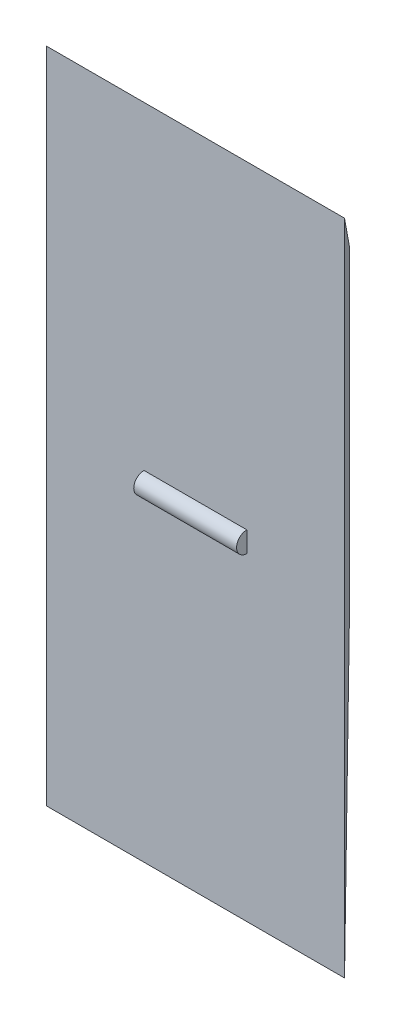
ISO-10303-21;
HEADER;
FILE_DESCRIPTION(('STEP AP214'),'2;1');
FILE_NAME('part.step','',(''),(''),'','','');
FILE_SCHEMA(('AUTOMOTIVE_DESIGN { 1 0 10303 214 1 1 1 1 }'));
ENDSEC;
DATA;
#1=APPLICATION_CONTEXT('core data for automotive mechanical design processes');
#2=APPLICATION_PROTOCOL_DEFINITION('international standard','automotive_design',2000,#1);
#3=PRODUCT_CONTEXT('',#1,'mechanical');
#4=PRODUCT('Part','Part','',(#3));
#5=PRODUCT_RELATED_PRODUCT_CATEGORY('part','',(#4));
#6=PRODUCT_DEFINITION_FORMATION('','',#4);
#7=PRODUCT_DEFINITION_CONTEXT('part definition',#1,'design');
#8=PRODUCT_DEFINITION('design','',#6,#7);
#9=PRODUCT_DEFINITION_SHAPE('','',#8);
#10=(LENGTH_UNIT() NAMED_UNIT(*) SI_UNIT(.MILLI.,.METRE.));
#11=(NAMED_UNIT(*) PLANE_ANGLE_UNIT() SI_UNIT($,.RADIAN.));
#12=(NAMED_UNIT(*) SI_UNIT($,.STERADIAN.) SOLID_ANGLE_UNIT());
#13=UNCERTAINTY_MEASURE_WITH_UNIT(LENGTH_MEASURE(1.E-05),#10,'distance_accuracy_value','');
#14=(GEOMETRIC_REPRESENTATION_CONTEXT(3) GLOBAL_UNCERTAINTY_ASSIGNED_CONTEXT((#13)) GLOBAL_UNIT_ASSIGNED_CONTEXT((#10,
#11,#12)) REPRESENTATION_CONTEXT('',''));
#15=CARTESIAN_POINT('',(0.,0.,0.));
#16=DIRECTION('',(0.,0.,1.));
#17=DIRECTION('',(1.,0.,0.));
#18=AXIS2_PLACEMENT_3D('',#15,#16,#17);
#19=CARTESIAN_POINT('',(0.,0.,30.));
#20=DIRECTION('',(0.,0.,1.));
#21=DIRECTION('',(1.,0.,0.));
#22=AXIS2_PLACEMENT_3D('',#19,#20,#21);
#23=PLANE('',#22);
#24=DIRECTION('',(1.,0.,0.));
#25=VECTOR('',#24,1.);
#26=CARTESIAN_POINT('',(-14.5,-64.,30.));
#27=LINE('',#26,#25);
#28=CARTESIAN_POINT('',(-14.5,-64.,30.));
#29=VERTEX_POINT('',#28);
#30=CARTESIAN_POINT('',(43.5,-64.,30.));
#31=VERTEX_POINT('',#30);
#32=EDGE_CURVE('E106',#29,#31,#27,.T.);
#33=ORIENTED_EDGE('',*,*,#32,.T.);
#34=DIRECTION('',(0.,1.,0.));
#35=VECTOR('',#34,1.);
#36=CARTESIAN_POINT('',(43.5,-64.,30.));
#37=LINE('',#36,#35);
#38=CARTESIAN_POINT('',(43.5,64.,30.));
#39=VERTEX_POINT('',#38);
#40=EDGE_CURVE('E187',#31,#39,#37,.T.);
#41=ORIENTED_EDGE('',*,*,#40,.T.);
#42=DIRECTION('',(-1.,0.,0.));
#43=VECTOR('',#42,1.);
#44=CARTESIAN_POINT('',(-14.5,64.,30.));
#45=LINE('',#44,#43);
#46=CARTESIAN_POINT('',(-14.5,64.,30.));
#47=VERTEX_POINT('',#46);
#48=EDGE_CURVE('E156',#39,#47,#45,.T.);
#49=ORIENTED_EDGE('',*,*,#48,.T.);
#50=DIRECTION('',(0.,-1.,0.));
#51=VECTOR('',#50,1.);
#52=CARTESIAN_POINT('',(-14.5,-64.,30.));
#53=LINE('',#52,#51);
#54=EDGE_CURVE('E113',#47,#29,#53,.T.);
#55=ORIENTED_EDGE('',*,*,#54,.T.);
#56=EDGE_LOOP('',(#33,#41,#49,#55));
#57=FACE_BOUND('',#56,.T.);
#58=DIRECTION('',(1.,0.,0.));
#59=VECTOR('',#58,1.);
#60=CARTESIAN_POINT('',(4.50000000000002,-2.,30.));
#61=LINE('',#60,#59);
#62=CARTESIAN_POINT('',(4.50000000000002,-2.,30.));
#63=VERTEX_POINT('',#62);
#64=CARTESIAN_POINT('',(24.5,-2.,30.));
#65=VERTEX_POINT('',#64);
#66=EDGE_CURVE('E52',#63,#65,#61,.T.);
#67=ORIENTED_EDGE('',*,*,#66,.F.);
#68=DIRECTION('',(0.,1.,0.));
#69=VECTOR('',#68,1.);
#70=CARTESIAN_POINT('',(4.50000000000002,0.,30.));
#71=LINE('',#70,#69);
#72=CARTESIAN_POINT('',(4.50000000000002,2.,30.));
#73=VERTEX_POINT('',#72);
#74=EDGE_CURVE('E12',#63,#73,#71,.T.);
#75=ORIENTED_EDGE('',*,*,#74,.T.);
#76=DIRECTION('',(1.,0.,0.));
#77=VECTOR('',#76,1.);
#78=CARTESIAN_POINT('',(4.50000000000002,2.,30.));
#79=LINE('',#78,#77);
#80=CARTESIAN_POINT('',(24.5,2.,30.));
#81=VERTEX_POINT('',#80);
#82=EDGE_CURVE('E89',#81,#73,#79,.F.);
#83=ORIENTED_EDGE('',*,*,#82,.F.);
#84=DIRECTION('',(0.,1.,0.));
#85=VECTOR('',#84,1.);
#86=CARTESIAN_POINT('',(24.5,0.,30.));
#87=LINE('',#86,#85);
#88=EDGE_CURVE('E91',#65,#81,#87,.T.);
#89=ORIENTED_EDGE('',*,*,#88,.F.);
#90=EDGE_LOOP('',(#67,#75,#83,#89));
#91=FACE_BOUND('',#90,.T.);
#92=ADVANCED_FACE('F43',(#57,#91),#23,.T.);
#93=CARTESIAN_POINT('',(0.,0.,0.));
#94=DIRECTION('',(0.,0.,1.));
#95=DIRECTION('',(1.,0.,0.));
#96=AXIS2_PLACEMENT_3D('',#93,#94,#95);
#97=PLANE('',#96);
#98=DIRECTION('',(0.,1.,0.));
#99=VECTOR('',#98,1.);
#100=CARTESIAN_POINT('',(14.5,29.5,0.));
#101=LINE('',#100,#99);
#102=CARTESIAN_POINT('',(14.5,-29.5,0.));
#103=VERTEX_POINT('',#102);
#104=CARTESIAN_POINT('',(14.5,29.5,0.));
#105=VERTEX_POINT('',#104);
#106=EDGE_CURVE('E235',#103,#105,#101,.T.);
#107=ORIENTED_EDGE('',*,*,#106,.F.);
#108=DIRECTION('',(1.,0.,0.));
#109=VECTOR('',#108,1.);
#110=CARTESIAN_POINT('',(-14.5,-29.5,0.));
#111=LINE('',#110,#109);
#112=CARTESIAN_POINT('',(-14.5,-29.5,0.));
#113=VERTEX_POINT('',#112);
#114=EDGE_CURVE('E229',#113,#103,#111,.T.);
#115=ORIENTED_EDGE('',*,*,#114,.F.);
#116=DIRECTION('',(0.,-1.,0.));
#117=VECTOR('',#116,1.);
#118=CARTESIAN_POINT('',(-14.5,29.5,0.));
#119=LINE('',#118,#117);
#120=CARTESIAN_POINT('',(-14.5,29.5,0.));
#121=VERTEX_POINT('',#120);
#122=EDGE_CURVE('E213',#121,#113,#119,.T.);
#123=ORIENTED_EDGE('',*,*,#122,.F.);
#124=DIRECTION('',(-1.,0.,0.));
#125=VECTOR('',#124,1.);
#126=CARTESIAN_POINT('',(-14.5,29.5,0.));
#127=LINE('',#126,#125);
#128=EDGE_CURVE('E101',#105,#121,#127,.T.);
#129=ORIENTED_EDGE('',*,*,#128,.F.);
#130=EDGE_LOOP('',(#107,#115,#123,#129));
#131=FACE_BOUND('',#130,.T.);
#132=ADVANCED_FACE('F45',(#131),#97,.F.);
#133=CARTESIAN_POINT('',(0.,12.7018299246502,-14.6071044133477));
#134=DIRECTION('',(0.,0.656178714924786,-0.754605522163505));
#135=DIRECTION('',(0.,0.754605522163505,0.656178714924787));
#136=AXIS2_PLACEMENT_3D('',#133,#134,#135);
#137=PLANE('',#136);
#138=DIRECTION('',(-0.535638231985947,-0.637224793224662,-0.554108515847532));
#139=VECTOR('',#138,1.);
#140=CARTESIAN_POINT('',(43.5,64.,30.));
#141=LINE('',#140,#139);
#142=EDGE_CURVE('E155',#39,#105,#141,.T.);
#143=ORIENTED_EDGE('',*,*,#142,.T.);
#144=ORIENTED_EDGE('',*,*,#128,.T.);
#145=DIRECTION('',(0.,-0.754605522163505,-0.656178714924787));
#146=VECTOR('',#145,1.);
#147=CARTESIAN_POINT('',(-14.5,64.,30.));
#148=LINE('',#147,#146);
#149=EDGE_CURVE('E119',#47,#121,#148,.T.);
#150=ORIENTED_EDGE('',*,*,#149,.F.);
#151=ORIENTED_EDGE('',*,*,#48,.F.);
#152=EDGE_LOOP('',(#143,#144,#150,#151));
#153=FACE_BOUND('',#152,.T.);
#154=ADVANCED_FACE('F132',(#153),#137,.T.);
#155=CARTESIAN_POINT('',(-14.5,0.,0.));
#156=DIRECTION('',(1.,0.,0.));
#157=DIRECTION('',(0.,0.,-1.));
#158=AXIS2_PLACEMENT_3D('',#155,#156,#157);
#159=PLANE('',#158);
#160=ORIENTED_EDGE('',*,*,#149,.T.);
#161=ORIENTED_EDGE('',*,*,#122,.T.);
#162=DIRECTION('',(0.,0.754605522163505,-0.656178714924787));
#163=VECTOR('',#162,1.);
#164=CARTESIAN_POINT('',(-14.5,-64.,30.));
#165=LINE('',#164,#163);
#166=EDGE_CURVE('E253',#29,#113,#165,.T.);
#167=ORIENTED_EDGE('',*,*,#166,.F.);
#168=ORIENTED_EDGE('',*,*,#54,.F.);
#169=EDGE_LOOP('',(#160,#161,#167,#168));
#170=FACE_BOUND('',#169,.T.);
#171=ADVANCED_FACE('F121',(#170),#159,.F.);
#172=CARTESIAN_POINT('',(7.49569213095922,0.,-7.24583572659391));
#173=DIRECTION('',(-0.718988376049112,0.,0.695022096847475));
#174=DIRECTION('',(0.695022096847475,0.,0.718988376049112));
#175=AXIS2_PLACEMENT_3D('',#172,#173,#174);
#176=PLANE('',#175);
#177=DIRECTION('',(-0.535638231985948,0.637224793224662,-0.554108515847532));
#178=VECTOR('',#177,1.);
#179=CARTESIAN_POINT('',(43.5,-64.,30.));
#180=LINE('',#179,#178);
#181=EDGE_CURVE('E255',#31,#103,#180,.T.);
#182=ORIENTED_EDGE('',*,*,#181,.T.);
#183=ORIENTED_EDGE('',*,*,#106,.T.);
#184=ORIENTED_EDGE('',*,*,#142,.F.);
#185=ORIENTED_EDGE('',*,*,#40,.F.);
#186=EDGE_LOOP('',(#182,#183,#184,#185));
#187=FACE_BOUND('',#186,.T.);
#188=ADVANCED_FACE('F131',(#187),#176,.F.);
#189=CARTESIAN_POINT('',(0.,-12.7018299246502,-14.6071044133477));
#190=DIRECTION('',(0.,-0.656178714924787,-0.754605522163505));
#191=DIRECTION('',(0.,0.754605522163505,-0.656178714924787));
#192=AXIS2_PLACEMENT_3D('',#189,#190,#191);
#193=PLANE('',#192);
#194=ORIENTED_EDGE('',*,*,#166,.T.);
#195=ORIENTED_EDGE('',*,*,#114,.T.);
#196=ORIENTED_EDGE('',*,*,#181,.F.);
#197=ORIENTED_EDGE('',*,*,#32,.F.);
#198=EDGE_LOOP('',(#194,#195,#196,#197));
#199=FACE_BOUND('',#198,.T.);
#200=ADVANCED_FACE('F301',(#199),#193,.T.);
#201=CARTESIAN_POINT('',(4.50000000000002,0.,30.));
#202=DIRECTION('',(1.,0.,0.));
#203=DIRECTION('',(0.,0.,-1.));
#204=AXIS2_PLACEMENT_3D('',#201,#202,#203);
#205=CYLINDRICAL_SURFACE('',#204,2.);
#206=CARTESIAN_POINT('',(4.50000000000002,0.,30.));
#207=DIRECTION('',(1.,0.,0.));
#208=DIRECTION('',(0.,0.,-1.));
#209=AXIS2_PLACEMENT_3D('',#206,#207,#208);
#210=CIRCLE('',#209,2.);
#211=EDGE_CURVE('E104',#73,#63,#210,.T.);
#212=ORIENTED_EDGE('',*,*,#211,.T.);
#213=ORIENTED_EDGE('',*,*,#66,.T.);
#214=CARTESIAN_POINT('',(24.5,0.,30.));
#215=DIRECTION('',(1.,0.,0.));
#216=DIRECTION('',(0.,0.,-1.));
#217=AXIS2_PLACEMENT_3D('',#214,#215,#216);
#218=CIRCLE('',#217,2.);
#219=EDGE_CURVE('E100',#81,#65,#218,.T.);
#220=ORIENTED_EDGE('',*,*,#219,.F.);
#221=ORIENTED_EDGE('',*,*,#82,.T.);
#222=EDGE_LOOP('',(#212,#213,#220,#221));
#223=FACE_BOUND('',#222,.T.);
#224=ADVANCED_FACE('F103',(#223),#205,.T.);
#225=CARTESIAN_POINT('',(4.50000000000002,0.,30.));
#226=DIRECTION('',(1.,0.,0.));
#227=DIRECTION('',(0.,0.,-1.));
#228=AXIS2_PLACEMENT_3D('',#225,#226,#227);
#229=PLANE('',#228);
#230=ORIENTED_EDGE('',*,*,#74,.F.);
#231=ORIENTED_EDGE('',*,*,#211,.F.);
#232=EDGE_LOOP('',(#230,#231));
#233=FACE_BOUND('',#232,.T.);
#234=ADVANCED_FACE('F350',(#233),#229,.F.);
#235=CARTESIAN_POINT('',(24.5,0.,30.));
#236=DIRECTION('',(1.,0.,0.));
#237=DIRECTION('',(0.,0.,-1.));
#238=AXIS2_PLACEMENT_3D('',#235,#236,#237);
#239=PLANE('',#238);
#240=ORIENTED_EDGE('',*,*,#219,.T.);
#241=ORIENTED_EDGE('',*,*,#88,.T.);
#242=EDGE_LOOP('',(#240,#241));
#243=FACE_BOUND('',#242,.T.);
#244=ADVANCED_FACE('F99',(#243),#239,.T.);
#245=CLOSED_SHELL('',(#92,#132,#154,#171,#188,#200,#224,#234,#244));
#246=MANIFOLD_SOLID_BREP('B2',#245);
#247=ADVANCED_BREP_SHAPE_REPRESENTATION('',(#18,#246),#14);
#248=SHAPE_DEFINITION_REPRESENTATION(#9,#247);
ENDSEC;
END-ISO-10303-21;
